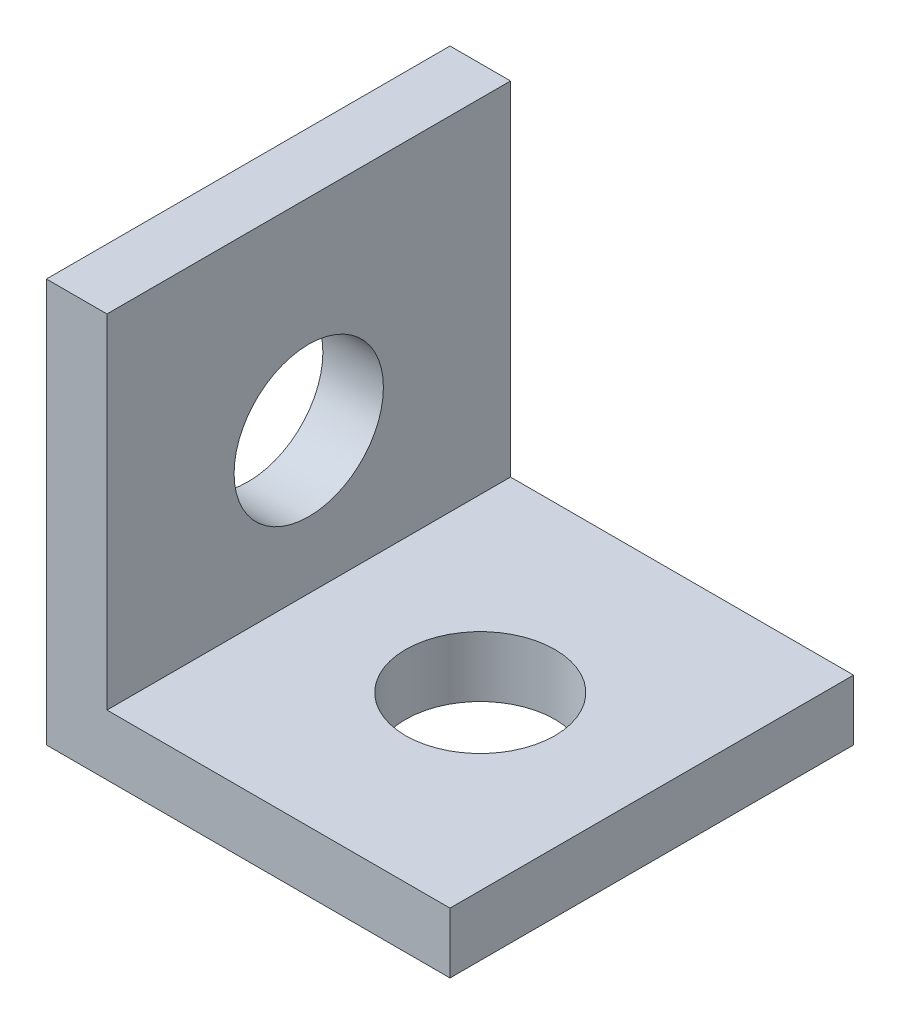
ISO-10303-21;
HEADER;
FILE_DESCRIPTION(('STEP AP214'),'2;1');
FILE_NAME('part.step','',(''),(''),'','','');
FILE_SCHEMA(('AUTOMOTIVE_DESIGN { 1 0 10303 214 1 1 1 1 }'));
ENDSEC;
DATA;
#1=APPLICATION_CONTEXT('core data for automotive mechanical design processes');
#2=APPLICATION_PROTOCOL_DEFINITION('international standard','automotive_design',2000,#1);
#3=PRODUCT_CONTEXT('',#1,'mechanical');
#4=PRODUCT('Part','Part','',(#3));
#5=PRODUCT_RELATED_PRODUCT_CATEGORY('part','',(#4));
#6=PRODUCT_DEFINITION_FORMATION('','',#4);
#7=PRODUCT_DEFINITION_CONTEXT('part definition',#1,'design');
#8=PRODUCT_DEFINITION('design','',#6,#7);
#9=PRODUCT_DEFINITION_SHAPE('','',#8);
#10=(LENGTH_UNIT() NAMED_UNIT(*) SI_UNIT(.MILLI.,.METRE.));
#11=(NAMED_UNIT(*) PLANE_ANGLE_UNIT() SI_UNIT($,.RADIAN.));
#12=(NAMED_UNIT(*) SI_UNIT($,.STERADIAN.) SOLID_ANGLE_UNIT());
#13=UNCERTAINTY_MEASURE_WITH_UNIT(LENGTH_MEASURE(1.E-05),#10,'distance_accuracy_value','');
#14=(GEOMETRIC_REPRESENTATION_CONTEXT(3) GLOBAL_UNCERTAINTY_ASSIGNED_CONTEXT((#13)) GLOBAL_UNIT_ASSIGNED_CONTEXT((#10,
#11,#12)) REPRESENTATION_CONTEXT('',''));
#15=CARTESIAN_POINT('',(0.,0.,0.));
#16=DIRECTION('',(0.,0.,1.));
#17=DIRECTION('',(1.,0.,0.));
#18=AXIS2_PLACEMENT_3D('',#15,#16,#17);
#19=CARTESIAN_POINT('',(1.5,-7.,20.));
#20=DIRECTION('',(-1.,0.,0.));
#21=DIRECTION('',(0.,-1.,0.));
#22=AXIS2_PLACEMENT_3D('',#19,#20,#21);
#23=PLANE('',#22);
#24=CARTESIAN_POINT('',(1.5,0.,10.));
#25=DIRECTION('',(1.,0.,0.));
#26=DIRECTION('',(0.,1.,0.));
#27=AXIS2_PLACEMENT_3D('',#24,#25,#26);
#28=CIRCLE('',#27,3.7);
#29=CARTESIAN_POINT('',(1.5,3.7,10.));
#30=VERTEX_POINT('',#29);
#31=EDGE_CURVE('E188',#30,#30,#28,.T.);
#32=ORIENTED_EDGE('',*,*,#31,.F.);
#33=EDGE_LOOP('',(#32));
#34=FACE_BOUND('',#33,.T.);
#35=DIRECTION('',(0.,1.,0.));
#36=VECTOR('',#35,1.);
#37=CARTESIAN_POINT('',(1.5,-7.,0.));
#38=LINE('',#37,#36);
#39=CARTESIAN_POINT('',(1.5,-7.,0.));
#40=VERTEX_POINT('',#39);
#41=CARTESIAN_POINT('',(1.5,10.,0.));
#42=VERTEX_POINT('',#41);
#43=EDGE_CURVE('E132',#40,#42,#38,.T.);
#44=ORIENTED_EDGE('',*,*,#43,.T.);
#45=DIRECTION('',(0.,0.,-1.));
#46=VECTOR('',#45,1.);
#47=CARTESIAN_POINT('',(1.5,10.,20.));
#48=LINE('',#47,#46);
#49=CARTESIAN_POINT('',(1.5,10.,20.));
#50=VERTEX_POINT('',#49);
#51=EDGE_CURVE('E11',#50,#42,#48,.T.);
#52=ORIENTED_EDGE('',*,*,#51,.F.);
#53=DIRECTION('',(0.,1.,0.));
#54=VECTOR('',#53,1.);
#55=CARTESIAN_POINT('',(1.5,-7.,20.));
#56=LINE('',#55,#54);
#57=CARTESIAN_POINT('',(1.5,-7.,20.));
#58=VERTEX_POINT('',#57);
#59=EDGE_CURVE('E150',#58,#50,#56,.T.);
#60=ORIENTED_EDGE('',*,*,#59,.F.);
#61=DIRECTION('',(0.,0.,-1.));
#62=VECTOR('',#61,1.);
#63=CARTESIAN_POINT('',(1.5,-7.,20.));
#64=LINE('',#63,#62);
#65=EDGE_CURVE('E128',#58,#40,#64,.T.);
#66=ORIENTED_EDGE('',*,*,#65,.T.);
#67=EDGE_LOOP('',(#44,#52,#60,#66));
#68=FACE_BOUND('',#67,.T.);
#69=ADVANCED_FACE('F43',(#34,#68),#23,.F.);
#70=CARTESIAN_POINT('',(-1.5,10.,20.));
#71=DIRECTION('',(0.,-1.,0.));
#72=DIRECTION('',(0.,0.,-1.));
#73=AXIS2_PLACEMENT_3D('',#70,#71,#72);
#74=PLANE('',#73);
#75=DIRECTION('',(-1.,0.,0.));
#76=VECTOR('',#75,1.);
#77=CARTESIAN_POINT('',(-1.5,10.,0.));
#78=LINE('',#77,#76);
#79=CARTESIAN_POINT('',(-1.5,10.,0.));
#80=VERTEX_POINT('',#79);
#81=EDGE_CURVE('E136',#42,#80,#78,.T.);
#82=ORIENTED_EDGE('',*,*,#81,.T.);
#83=DIRECTION('',(0.,0.,-1.));
#84=VECTOR('',#83,1.);
#85=CARTESIAN_POINT('',(-1.5,10.,20.));
#86=LINE('',#85,#84);
#87=CARTESIAN_POINT('',(-1.5,10.,20.));
#88=VERTEX_POINT('',#87);
#89=EDGE_CURVE('E53',#88,#80,#86,.T.);
#90=ORIENTED_EDGE('',*,*,#89,.F.);
#91=DIRECTION('',(-1.,0.,0.));
#92=VECTOR('',#91,1.);
#93=CARTESIAN_POINT('',(-1.5,10.,20.));
#94=LINE('',#93,#92);
#95=EDGE_CURVE('E98',#50,#88,#94,.T.);
#96=ORIENTED_EDGE('',*,*,#95,.F.);
#97=ORIENTED_EDGE('',*,*,#51,.T.);
#98=EDGE_LOOP('',(#82,#90,#96,#97));
#99=FACE_BOUND('',#98,.T.);
#100=ADVANCED_FACE('F181',(#99),#74,.F.);
#101=CARTESIAN_POINT('',(-1.5,-10.,20.));
#102=DIRECTION('',(1.,0.,0.));
#103=DIRECTION('',(0.,0.,-1.));
#104=AXIS2_PLACEMENT_3D('',#101,#102,#103);
#105=PLANE('',#104);
#106=CARTESIAN_POINT('',(-1.5,0.,10.));
#107=DIRECTION('',(1.,0.,0.));
#108=DIRECTION('',(0.,0.,-1.));
#109=AXIS2_PLACEMENT_3D('',#106,#107,#108);
#110=CIRCLE('',#109,3.7);
#111=CARTESIAN_POINT('',(-1.5,0.,6.3));
#112=VERTEX_POINT('',#111);
#113=EDGE_CURVE('E46',#112,#112,#110,.T.);
#114=ORIENTED_EDGE('',*,*,#113,.T.);
#115=EDGE_LOOP('',(#114));
#116=FACE_BOUND('',#115,.T.);
#117=DIRECTION('',(0.,-1.,0.));
#118=VECTOR('',#117,1.);
#119=CARTESIAN_POINT('',(-1.5,-10.,0.));
#120=LINE('',#119,#118);
#121=CARTESIAN_POINT('',(-1.5,-10.,0.));
#122=VERTEX_POINT('',#121);
#123=EDGE_CURVE('E140',#80,#122,#120,.T.);
#124=ORIENTED_EDGE('',*,*,#123,.T.);
#125=DIRECTION('',(0.,0.,-1.));
#126=VECTOR('',#125,1.);
#127=CARTESIAN_POINT('',(-1.5,-10.,20.));
#128=LINE('',#127,#126);
#129=CARTESIAN_POINT('',(-1.5,-10.,20.));
#130=VERTEX_POINT('',#129);
#131=EDGE_CURVE('E121',#130,#122,#128,.T.);
#132=ORIENTED_EDGE('',*,*,#131,.F.);
#133=DIRECTION('',(0.,-1.,0.));
#134=VECTOR('',#133,1.);
#135=CARTESIAN_POINT('',(-1.5,-10.,20.));
#136=LINE('',#135,#134);
#137=EDGE_CURVE('E111',#88,#130,#136,.T.);
#138=ORIENTED_EDGE('',*,*,#137,.F.);
#139=ORIENTED_EDGE('',*,*,#89,.T.);
#140=EDGE_LOOP('',(#124,#132,#138,#139));
#141=FACE_BOUND('',#140,.T.);
#142=ADVANCED_FACE('F161',(#116,#141),#105,.F.);
#143=CARTESIAN_POINT('',(1.5,-10.,20.));
#144=DIRECTION('',(0.,1.,0.));
#145=DIRECTION('',(-1.,0.,0.));
#146=AXIS2_PLACEMENT_3D('',#143,#144,#145);
#147=PLANE('',#146);
#148=CARTESIAN_POINT('',(10.,-10.,10.));
#149=DIRECTION('',(0.,1.,0.));
#150=DIRECTION('',(-1.,0.,0.));
#151=AXIS2_PLACEMENT_3D('',#148,#149,#150);
#152=CIRCLE('',#151,3.7);
#153=CARTESIAN_POINT('',(6.3,-10.,10.));
#154=VERTEX_POINT('',#153);
#155=EDGE_CURVE('E137',#154,#154,#152,.T.);
#156=ORIENTED_EDGE('',*,*,#155,.T.);
#157=EDGE_LOOP('',(#156));
#158=FACE_BOUND('',#157,.T.);
#159=DIRECTION('',(1.,0.,0.));
#160=VECTOR('',#159,1.);
#161=CARTESIAN_POINT('',(1.5,-10.,0.));
#162=LINE('',#161,#160);
#163=CARTESIAN_POINT('',(18.5,-10.,0.));
#164=VERTEX_POINT('',#163);
#165=EDGE_CURVE('E119',#122,#164,#162,.T.);
#166=ORIENTED_EDGE('',*,*,#165,.T.);
#167=DIRECTION('',(0.,0.,-1.));
#168=VECTOR('',#167,1.);
#169=CARTESIAN_POINT('',(18.5,-10.,20.));
#170=LINE('',#169,#168);
#171=CARTESIAN_POINT('',(18.5,-10.,20.));
#172=VERTEX_POINT('',#171);
#173=EDGE_CURVE('E117',#172,#164,#170,.T.);
#174=ORIENTED_EDGE('',*,*,#173,.F.);
#175=DIRECTION('',(1.,0.,0.));
#176=VECTOR('',#175,1.);
#177=CARTESIAN_POINT('',(-1.5,-10.,20.));
#178=LINE('',#177,#176);
#179=EDGE_CURVE('E105',#130,#172,#178,.T.);
#180=ORIENTED_EDGE('',*,*,#179,.F.);
#181=ORIENTED_EDGE('',*,*,#131,.T.);
#182=EDGE_LOOP('',(#166,#174,#180,#181));
#183=FACE_BOUND('',#182,.T.);
#184=ADVANCED_FACE('F118',(#158,#183),#147,.F.);
#185=CARTESIAN_POINT('',(18.5,-10.,20.));
#186=DIRECTION('',(-1.,0.,0.));
#187=DIRECTION('',(0.,0.,1.));
#188=AXIS2_PLACEMENT_3D('',#185,#186,#187);
#189=PLANE('',#188);
#190=DIRECTION('',(0.,1.,0.));
#191=VECTOR('',#190,1.);
#192=CARTESIAN_POINT('',(18.5,-10.,0.));
#193=LINE('',#192,#191);
#194=CARTESIAN_POINT('',(18.5,-7.,0.));
#195=VERTEX_POINT('',#194);
#196=EDGE_CURVE('E84',#164,#195,#193,.T.);
#197=ORIENTED_EDGE('',*,*,#196,.T.);
#198=DIRECTION('',(0.,0.,-1.));
#199=VECTOR('',#198,1.);
#200=CARTESIAN_POINT('',(18.5,-7.,20.));
#201=LINE('',#200,#199);
#202=CARTESIAN_POINT('',(18.5,-7.,20.));
#203=VERTEX_POINT('',#202);
#204=EDGE_CURVE('E122',#203,#195,#201,.T.);
#205=ORIENTED_EDGE('',*,*,#204,.F.);
#206=DIRECTION('',(0.,1.,0.));
#207=VECTOR('',#206,1.);
#208=CARTESIAN_POINT('',(18.5,-10.,20.));
#209=LINE('',#208,#207);
#210=EDGE_CURVE('E109',#172,#203,#209,.T.);
#211=ORIENTED_EDGE('',*,*,#210,.F.);
#212=ORIENTED_EDGE('',*,*,#173,.T.);
#213=EDGE_LOOP('',(#197,#205,#211,#212));
#214=FACE_BOUND('',#213,.T.);
#215=ADVANCED_FACE('F124',(#214),#189,.F.);
#216=CARTESIAN_POINT('',(18.5,-7.,20.));
#217=DIRECTION('',(0.,-1.,0.));
#218=DIRECTION('',(0.,0.,-1.));
#219=AXIS2_PLACEMENT_3D('',#216,#217,#218);
#220=PLANE('',#219);
#221=CARTESIAN_POINT('',(10.,-7.,10.));
#222=DIRECTION('',(0.,1.,0.));
#223=DIRECTION('',(0.,0.,1.));
#224=AXIS2_PLACEMENT_3D('',#221,#222,#223);
#225=CIRCLE('',#224,3.7);
#226=CARTESIAN_POINT('',(10.,-7.,13.7));
#227=VERTEX_POINT('',#226);
#228=EDGE_CURVE('E194',#227,#227,#225,.T.);
#229=ORIENTED_EDGE('',*,*,#228,.F.);
#230=EDGE_LOOP('',(#229));
#231=FACE_BOUND('',#230,.T.);
#232=DIRECTION('',(-1.,0.,0.));
#233=VECTOR('',#232,1.);
#234=CARTESIAN_POINT('',(18.5,-7.,0.));
#235=LINE('',#234,#233);
#236=EDGE_CURVE('E90',#195,#40,#235,.T.);
#237=ORIENTED_EDGE('',*,*,#236,.T.);
#238=ORIENTED_EDGE('',*,*,#65,.F.);
#239=DIRECTION('',(-1.,0.,0.));
#240=VECTOR('',#239,1.);
#241=CARTESIAN_POINT('',(18.5,-7.,20.));
#242=LINE('',#241,#240);
#243=EDGE_CURVE('E61',#203,#58,#242,.T.);
#244=ORIENTED_EDGE('',*,*,#243,.F.);
#245=ORIENTED_EDGE('',*,*,#204,.T.);
#246=EDGE_LOOP('',(#237,#238,#244,#245));
#247=FACE_BOUND('',#246,.T.);
#248=ADVANCED_FACE('F168',(#231,#247),#220,.F.);
#249=CARTESIAN_POINT('',(0.,0.,20.));
#250=DIRECTION('',(0.,0.,-1.));
#251=DIRECTION('',(-1.,0.,0.));
#252=AXIS2_PLACEMENT_3D('',#249,#250,#251);
#253=PLANE('',#252);
#254=ORIENTED_EDGE('',*,*,#59,.T.);
#255=ORIENTED_EDGE('',*,*,#95,.T.);
#256=ORIENTED_EDGE('',*,*,#137,.T.);
#257=ORIENTED_EDGE('',*,*,#179,.T.);
#258=ORIENTED_EDGE('',*,*,#210,.T.);
#259=ORIENTED_EDGE('',*,*,#243,.T.);
#260=EDGE_LOOP('',(#254,#255,#256,#257,#258,#259));
#261=FACE_BOUND('',#260,.T.);
#262=ADVANCED_FACE('F107',(#261),#253,.F.);
#263=CARTESIAN_POINT('',(0.,0.,0.));
#264=DIRECTION('',(0.,0.,-1.));
#265=DIRECTION('',(-1.,0.,0.));
#266=AXIS2_PLACEMENT_3D('',#263,#264,#265);
#267=PLANE('',#266);
#268=ORIENTED_EDGE('',*,*,#43,.F.);
#269=ORIENTED_EDGE('',*,*,#236,.F.);
#270=ORIENTED_EDGE('',*,*,#196,.F.);
#271=ORIENTED_EDGE('',*,*,#165,.F.);
#272=ORIENTED_EDGE('',*,*,#123,.F.);
#273=ORIENTED_EDGE('',*,*,#81,.F.);
#274=EDGE_LOOP('',(#268,#269,#270,#271,#272,#273));
#275=FACE_BOUND('',#274,.T.);
#276=ADVANCED_FACE('F164',(#275),#267,.T.);
#277=CARTESIAN_POINT('',(10.,-27.,10.));
#278=DIRECTION('',(0.,1.,0.));
#279=DIRECTION('',(0.,0.,1.));
#280=AXIS2_PLACEMENT_3D('',#277,#278,#279);
#281=CYLINDRICAL_SURFACE('',#280,3.7);
#282=ORIENTED_EDGE('',*,*,#228,.T.);
#283=EDGE_LOOP('',(#282));
#284=FACE_BOUND('',#283,.T.);
#285=ORIENTED_EDGE('',*,*,#155,.F.);
#286=EDGE_LOOP('',(#285));
#287=FACE_BOUND('',#286,.T.);
#288=ADVANCED_FACE('F209',(#284,#287),#281,.F.);
#289=CARTESIAN_POINT('',(-18.5,0.,10.));
#290=DIRECTION('',(1.,0.,0.));
#291=DIRECTION('',(0.,1.,0.));
#292=AXIS2_PLACEMENT_3D('',#289,#290,#291);
#293=CYLINDRICAL_SURFACE('',#292,3.7);
#294=ORIENTED_EDGE('',*,*,#31,.T.);
#295=EDGE_LOOP('',(#294));
#296=FACE_BOUND('',#295,.T.);
#297=ORIENTED_EDGE('',*,*,#113,.F.);
#298=EDGE_LOOP('',(#297));
#299=FACE_BOUND('',#298,.T.);
#300=ADVANCED_FACE('F211',(#296,#299),#293,.F.);
#301=CLOSED_SHELL('',(#69,#100,#142,#184,#215,#248,#262,#276,#288,#300));
#302=MANIFOLD_SOLID_BREP('B2',#301);
#303=ADVANCED_BREP_SHAPE_REPRESENTATION('',(#18,#302),#14);
#304=SHAPE_DEFINITION_REPRESENTATION(#9,#303);
ENDSEC;
END-ISO-10303-21;
